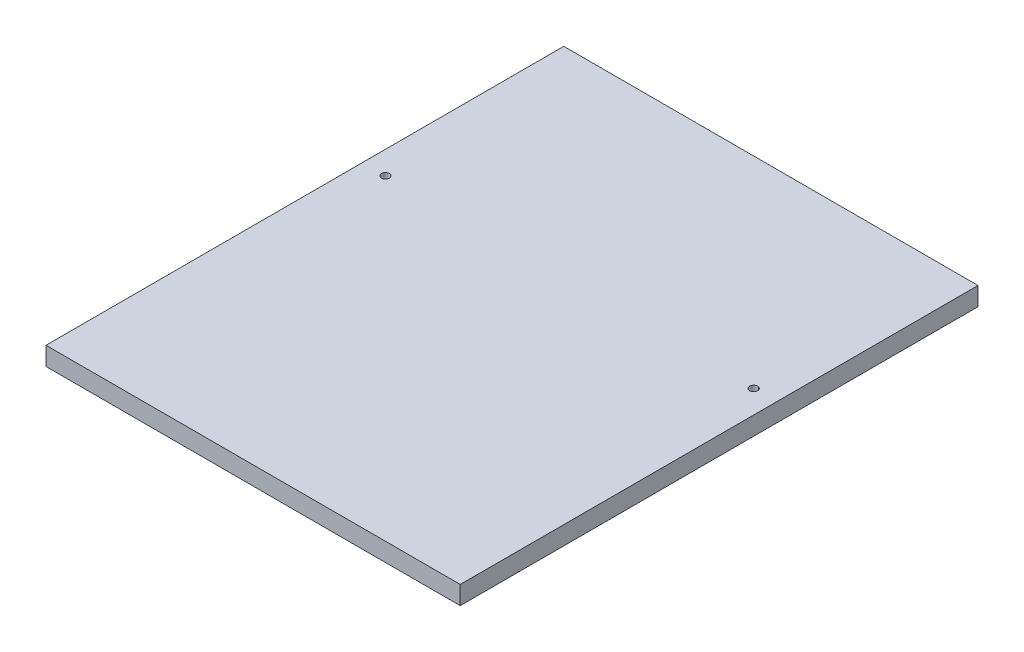
ISO-10303-21;
HEADER;
FILE_DESCRIPTION(('STEP AP214'),'2;1');
FILE_NAME('part.step','',(''),(''),'','','');
FILE_SCHEMA(('AUTOMOTIVE_DESIGN { 1 0 10303 214 1 1 1 1 }'));
ENDSEC;
DATA;
#1=APPLICATION_CONTEXT('core data for automotive mechanical design processes');
#2=APPLICATION_PROTOCOL_DEFINITION('international standard','automotive_design',2000,#1);
#3=PRODUCT_CONTEXT('',#1,'mechanical');
#4=PRODUCT('Part','Part','',(#3));
#5=PRODUCT_RELATED_PRODUCT_CATEGORY('part','',(#4));
#6=PRODUCT_DEFINITION_FORMATION('','',#4);
#7=PRODUCT_DEFINITION_CONTEXT('part definition',#1,'design');
#8=PRODUCT_DEFINITION('design','',#6,#7);
#9=PRODUCT_DEFINITION_SHAPE('','',#8);
#10=(LENGTH_UNIT() NAMED_UNIT(*) SI_UNIT(.MILLI.,.METRE.));
#11=(NAMED_UNIT(*) PLANE_ANGLE_UNIT() SI_UNIT($,.RADIAN.));
#12=(NAMED_UNIT(*) SI_UNIT($,.STERADIAN.) SOLID_ANGLE_UNIT());
#13=UNCERTAINTY_MEASURE_WITH_UNIT(LENGTH_MEASURE(1.E-05),#10,'distance_accuracy_value','');
#14=(GEOMETRIC_REPRESENTATION_CONTEXT(3) GLOBAL_UNCERTAINTY_ASSIGNED_CONTEXT((#13)) GLOBAL_UNIT_ASSIGNED_CONTEXT((#10,
#11,#12)) REPRESENTATION_CONTEXT('',''));
#15=CARTESIAN_POINT('',(0.,0.,0.));
#16=DIRECTION('',(0.,0.,1.));
#17=DIRECTION('',(1.,0.,0.));
#18=AXIS2_PLACEMENT_3D('',#15,#16,#17);
#19=CARTESIAN_POINT('',(0.,16.,0.));
#20=DIRECTION('',(0.,-1.,0.));
#21=DIRECTION('',(0.,0.,-1.));
#22=AXIS2_PLACEMENT_3D('',#19,#20,#21);
#23=PLANE('',#22);
#24=CARTESIAN_POINT('',(20.,16.,-275.));
#25=DIRECTION('',(0.,1.,0.));
#26=DIRECTION('',(0.,0.,1.));
#27=AXIS2_PLACEMENT_3D('',#24,#25,#26);
#28=CIRCLE('',#27,3.5);
#29=CARTESIAN_POINT('',(20.,16.,-271.5));
#30=VERTEX_POINT('',#29);
#31=EDGE_CURVE('E102',#30,#30,#28,.T.);
#32=ORIENTED_EDGE('',*,*,#31,.F.);
#33=EDGE_LOOP('',(#32));
#34=FACE_BOUND('',#33,.T.);
#35=DIRECTION('',(0.,0.,1.));
#36=VECTOR('',#35,1.);
#37=CARTESIAN_POINT('',(0.,16.,0.));
#38=LINE('',#37,#36);
#39=CARTESIAN_POINT('',(0.,16.,-450.));
#40=VERTEX_POINT('',#39);
#41=CARTESIAN_POINT('',(0.,16.,0.));
#42=VERTEX_POINT('',#41);
#43=EDGE_CURVE('E87',#40,#42,#38,.T.);
#44=ORIENTED_EDGE('',*,*,#43,.T.);
#45=DIRECTION('',(1.,0.,0.));
#46=VECTOR('',#45,1.);
#47=CARTESIAN_POINT('',(0.,16.,0.));
#48=LINE('',#47,#46);
#49=CARTESIAN_POINT('',(360.,16.,0.));
#50=VERTEX_POINT('',#49);
#51=EDGE_CURVE('E82',#42,#50,#48,.T.);
#52=ORIENTED_EDGE('',*,*,#51,.T.);
#53=DIRECTION('',(0.,0.,-1.));
#54=VECTOR('',#53,1.);
#55=CARTESIAN_POINT('',(360.,16.,0.));
#56=LINE('',#55,#54);
#57=CARTESIAN_POINT('',(360.,16.,-450.));
#58=VERTEX_POINT('',#57);
#59=EDGE_CURVE('E85',#50,#58,#56,.T.);
#60=ORIENTED_EDGE('',*,*,#59,.T.);
#61=DIRECTION('',(-1.,0.,0.));
#62=VECTOR('',#61,1.);
#63=CARTESIAN_POINT('',(0.,16.,-450.));
#64=LINE('',#63,#62);
#65=EDGE_CURVE('E52',#58,#40,#64,.T.);
#66=ORIENTED_EDGE('',*,*,#65,.T.);
#67=EDGE_LOOP('',(#44,#52,#60,#66));
#68=FACE_BOUND('',#67,.T.);
#69=CARTESIAN_POINT('',(340.,16.,-275.));
#70=DIRECTION('',(0.,1.,0.));
#71=DIRECTION('',(0.,0.,1.));
#72=AXIS2_PLACEMENT_3D('',#69,#70,#71);
#73=CIRCLE('',#72,3.50000000000002);
#74=CARTESIAN_POINT('',(340.,16.,-271.5));
#75=VERTEX_POINT('',#74);
#76=EDGE_CURVE('E117',#75,#75,#73,.T.);
#77=ORIENTED_EDGE('',*,*,#76,.F.);
#78=EDGE_LOOP('',(#77));
#79=FACE_BOUND('',#78,.T.);
#80=ADVANCED_FACE('F35',(#34,#68,#79),#23,.F.);
#81=CARTESIAN_POINT('',(0.,0.,0.));
#82=DIRECTION('',(0.,-1.,0.));
#83=DIRECTION('',(0.,0.,-1.));
#84=AXIS2_PLACEMENT_3D('',#81,#82,#83);
#85=PLANE('',#84);
#86=CARTESIAN_POINT('',(20.,0.,-275.));
#87=DIRECTION('',(0.,1.,0.));
#88=DIRECTION('',(0.,0.,1.));
#89=AXIS2_PLACEMENT_3D('',#86,#87,#88);
#90=CIRCLE('',#89,3.5);
#91=CARTESIAN_POINT('',(20.,0.,-271.5));
#92=VERTEX_POINT('',#91);
#93=EDGE_CURVE('E114',#92,#92,#90,.T.);
#94=ORIENTED_EDGE('',*,*,#93,.T.);
#95=EDGE_LOOP('',(#94));
#96=FACE_BOUND('',#95,.T.);
#97=DIRECTION('',(0.,0.,1.));
#98=VECTOR('',#97,1.);
#99=CARTESIAN_POINT('',(0.,0.,0.));
#100=LINE('',#99,#98);
#101=CARTESIAN_POINT('',(0.,0.,-450.));
#102=VERTEX_POINT('',#101);
#103=CARTESIAN_POINT('',(0.,0.,0.));
#104=VERTEX_POINT('',#103);
#105=EDGE_CURVE('E99',#102,#104,#100,.T.);
#106=ORIENTED_EDGE('',*,*,#105,.F.);
#107=DIRECTION('',(-1.,0.,0.));
#108=VECTOR('',#107,1.);
#109=CARTESIAN_POINT('',(0.,0.,-450.));
#110=LINE('',#109,#108);
#111=CARTESIAN_POINT('',(360.,0.,-450.));
#112=VERTEX_POINT('',#111);
#113=EDGE_CURVE('E75',#112,#102,#110,.T.);
#114=ORIENTED_EDGE('',*,*,#113,.F.);
#115=DIRECTION('',(0.,0.,-1.));
#116=VECTOR('',#115,1.);
#117=CARTESIAN_POINT('',(360.,0.,0.));
#118=LINE('',#117,#116);
#119=CARTESIAN_POINT('',(360.,0.,0.));
#120=VERTEX_POINT('',#119);
#121=EDGE_CURVE('E69',#120,#112,#118,.T.);
#122=ORIENTED_EDGE('',*,*,#121,.F.);
#123=DIRECTION('',(1.,0.,0.));
#124=VECTOR('',#123,1.);
#125=CARTESIAN_POINT('',(0.,0.,0.));
#126=LINE('',#125,#124);
#127=EDGE_CURVE('E91',#104,#120,#126,.T.);
#128=ORIENTED_EDGE('',*,*,#127,.F.);
#129=EDGE_LOOP('',(#106,#114,#122,#128));
#130=FACE_BOUND('',#129,.T.);
#131=CARTESIAN_POINT('',(340.,0.,-275.));
#132=DIRECTION('',(0.,1.,0.));
#133=DIRECTION('',(0.,0.,1.));
#134=AXIS2_PLACEMENT_3D('',#131,#132,#133);
#135=CIRCLE('',#134,3.50000000000002);
#136=CARTESIAN_POINT('',(340.,0.,-271.5));
#137=VERTEX_POINT('',#136);
#138=EDGE_CURVE('E120',#137,#137,#135,.T.);
#139=ORIENTED_EDGE('',*,*,#138,.T.);
#140=EDGE_LOOP('',(#139));
#141=FACE_BOUND('',#140,.T.);
#142=ADVANCED_FACE('F110',(#96,#130,#141),#85,.T.);
#143=CARTESIAN_POINT('',(0.,16.,0.));
#144=DIRECTION('',(1.,0.,0.));
#145=DIRECTION('',(0.,0.,-1.));
#146=AXIS2_PLACEMENT_3D('',#143,#144,#145);
#147=PLANE('',#146);
#148=ORIENTED_EDGE('',*,*,#105,.T.);
#149=DIRECTION('',(0.,-1.,0.));
#150=VECTOR('',#149,1.);
#151=CARTESIAN_POINT('',(0.,16.,0.));
#152=LINE('',#151,#150);
#153=EDGE_CURVE('E11',#42,#104,#152,.T.);
#154=ORIENTED_EDGE('',*,*,#153,.F.);
#155=ORIENTED_EDGE('',*,*,#43,.F.);
#156=DIRECTION('',(0.,-1.,0.));
#157=VECTOR('',#156,1.);
#158=CARTESIAN_POINT('',(0.,16.,-450.));
#159=LINE('',#158,#157);
#160=EDGE_CURVE('E95',#40,#102,#159,.T.);
#161=ORIENTED_EDGE('',*,*,#160,.T.);
#162=EDGE_LOOP('',(#148,#154,#155,#161));
#163=FACE_BOUND('',#162,.T.);
#164=ADVANCED_FACE('F37',(#163),#147,.F.);
#165=CARTESIAN_POINT('',(0.,16.,0.));
#166=DIRECTION('',(0.,0.,-1.));
#167=DIRECTION('',(-1.,0.,0.));
#168=AXIS2_PLACEMENT_3D('',#165,#166,#167);
#169=PLANE('',#168);
#170=ORIENTED_EDGE('',*,*,#127,.T.);
#171=DIRECTION('',(0.,-1.,0.));
#172=VECTOR('',#171,1.);
#173=CARTESIAN_POINT('',(360.,16.,0.));
#174=LINE('',#173,#172);
#175=EDGE_CURVE('E44',#50,#120,#174,.T.);
#176=ORIENTED_EDGE('',*,*,#175,.F.);
#177=ORIENTED_EDGE('',*,*,#51,.F.);
#178=ORIENTED_EDGE('',*,*,#153,.T.);
#179=EDGE_LOOP('',(#170,#176,#177,#178));
#180=FACE_BOUND('',#179,.T.);
#181=ADVANCED_FACE('F90',(#180),#169,.F.);
#182=CARTESIAN_POINT('',(360.,16.,0.));
#183=DIRECTION('',(-1.,0.,0.));
#184=DIRECTION('',(0.,0.,1.));
#185=AXIS2_PLACEMENT_3D('',#182,#183,#184);
#186=PLANE('',#185);
#187=ORIENTED_EDGE('',*,*,#121,.T.);
#188=DIRECTION('',(0.,-1.,0.));
#189=VECTOR('',#188,1.);
#190=CARTESIAN_POINT('',(360.,16.,-450.));
#191=LINE('',#190,#189);
#192=EDGE_CURVE('E92',#58,#112,#191,.T.);
#193=ORIENTED_EDGE('',*,*,#192,.F.);
#194=ORIENTED_EDGE('',*,*,#59,.F.);
#195=ORIENTED_EDGE('',*,*,#175,.T.);
#196=EDGE_LOOP('',(#187,#193,#194,#195));
#197=FACE_BOUND('',#196,.T.);
#198=ADVANCED_FACE('F93',(#197),#186,.F.);
#199=CARTESIAN_POINT('',(0.,16.,-450.));
#200=DIRECTION('',(0.,0.,1.));
#201=DIRECTION('',(1.,0.,0.));
#202=AXIS2_PLACEMENT_3D('',#199,#200,#201);
#203=PLANE('',#202);
#204=ORIENTED_EDGE('',*,*,#113,.T.);
#205=ORIENTED_EDGE('',*,*,#160,.F.);
#206=ORIENTED_EDGE('',*,*,#65,.F.);
#207=ORIENTED_EDGE('',*,*,#192,.T.);
#208=EDGE_LOOP('',(#204,#205,#206,#207));
#209=FACE_BOUND('',#208,.T.);
#210=ADVANCED_FACE('F107',(#209),#203,.F.);
#211=CARTESIAN_POINT('',(20.,16.,-275.));
#212=DIRECTION('',(0.,-1.,0.));
#213=DIRECTION('',(0.,0.,-1.));
#214=AXIS2_PLACEMENT_3D('',#211,#212,#213);
#215=CYLINDRICAL_SURFACE('',#214,3.5);
#216=ORIENTED_EDGE('',*,*,#31,.T.);
#217=EDGE_LOOP('',(#216));
#218=FACE_BOUND('',#217,.T.);
#219=ORIENTED_EDGE('',*,*,#93,.F.);
#220=EDGE_LOOP('',(#219));
#221=FACE_BOUND('',#220,.T.);
#222=ADVANCED_FACE('F138',(#218,#221),#215,.F.);
#223=CARTESIAN_POINT('',(340.,16.,-275.));
#224=DIRECTION('',(0.,-1.,0.));
#225=DIRECTION('',(0.,0.,-1.));
#226=AXIS2_PLACEMENT_3D('',#223,#224,#225);
#227=CYLINDRICAL_SURFACE('',#226,3.50000000000002);
#228=ORIENTED_EDGE('',*,*,#76,.T.);
#229=EDGE_LOOP('',(#228));
#230=FACE_BOUND('',#229,.T.);
#231=ORIENTED_EDGE('',*,*,#138,.F.);
#232=EDGE_LOOP('',(#231));
#233=FACE_BOUND('',#232,.T.);
#234=ADVANCED_FACE('F126',(#230,#233),#227,.F.);
#235=CLOSED_SHELL('',(#80,#142,#164,#181,#198,#210,#222,#234));
#236=MANIFOLD_SOLID_BREP('B2',#235);
#237=ADVANCED_BREP_SHAPE_REPRESENTATION('',(#18,#236),#14);
#238=SHAPE_DEFINITION_REPRESENTATION(#9,#237);
ENDSEC;
END-ISO-10303-21;
